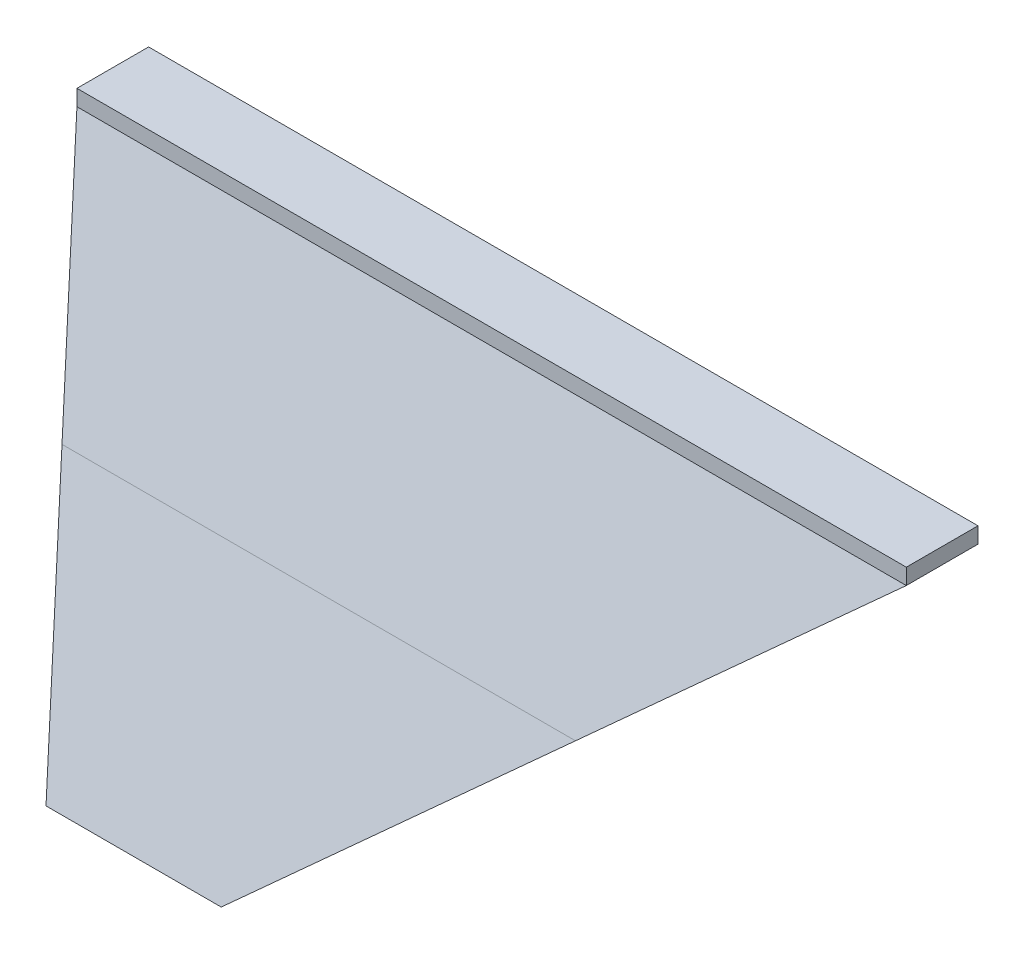
ISO-10303-21;
HEADER;
FILE_DESCRIPTION(('STEP AP214'),'2;1');
FILE_NAME('part.step','',(''),(''),'','','');
FILE_SCHEMA(('AUTOMOTIVE_DESIGN { 1 0 10303 214 1 1 1 1 }'));
ENDSEC;
DATA;
#1=APPLICATION_CONTEXT('core data for automotive mechanical design processes');
#2=APPLICATION_PROTOCOL_DEFINITION('international standard','automotive_design',2000,#1);
#3=PRODUCT_CONTEXT('',#1,'mechanical');
#4=PRODUCT('Part','Part','',(#3));
#5=PRODUCT_RELATED_PRODUCT_CATEGORY('part','',(#4));
#6=PRODUCT_DEFINITION_FORMATION('','',#4);
#7=PRODUCT_DEFINITION_CONTEXT('part definition',#1,'design');
#8=PRODUCT_DEFINITION('design','',#6,#7);
#9=PRODUCT_DEFINITION_SHAPE('','',#8);
#10=(LENGTH_UNIT() NAMED_UNIT(*) SI_UNIT(.MILLI.,.METRE.));
#11=(NAMED_UNIT(*) PLANE_ANGLE_UNIT() SI_UNIT($,.RADIAN.));
#12=(NAMED_UNIT(*) SI_UNIT($,.STERADIAN.) SOLID_ANGLE_UNIT());
#13=UNCERTAINTY_MEASURE_WITH_UNIT(LENGTH_MEASURE(1.E-05),#10,'distance_accuracy_value','');
#14=(GEOMETRIC_REPRESENTATION_CONTEXT(3) GLOBAL_UNCERTAINTY_ASSIGNED_CONTEXT((#13)) GLOBAL_UNIT_ASSIGNED_CONTEXT((#10,
#11,#12)) REPRESENTATION_CONTEXT('',''));
#15=CARTESIAN_POINT('',(0.,0.,0.));
#16=DIRECTION('',(0.,0.,1.));
#17=DIRECTION('',(1.,0.,0.));
#18=AXIS2_PLACEMENT_3D('',#15,#16,#17);
#19=CARTESIAN_POINT('',(0.,-70.5249999999999,0.));
#20=DIRECTION('',(0.,1.,0.));
#21=DIRECTION('',(0.,0.,1.));
#22=AXIS2_PLACEMENT_3D('',#19,#20,#21);
#23=PLANE('',#22);
#24=DIRECTION('',(0.,0.,-1.));
#25=VECTOR('',#24,1.);
#26=CARTESIAN_POINT('',(-44.5830751454981,-70.5249999999999,0.));
#27=LINE('',#26,#25);
#28=CARTESIAN_POINT('',(-44.5830751454981,-70.5249999999999,-44.1671716535433));
#29=VERTEX_POINT('',#28);
#30=CARTESIAN_POINT('',(-44.5830751454981,-70.5249999999999,-46.6671716535434));
#31=VERTEX_POINT('',#30);
#32=EDGE_CURVE('E165',#29,#31,#27,.T.);
#33=ORIENTED_EDGE('',*,*,#32,.F.);
#34=DIRECTION('',(1.,0.,0.));
#35=VECTOR('',#34,1.);
#36=CARTESIAN_POINT('',(111.2625,-70.5249999999999,-44.1671716535434));
#37=LINE('',#36,#35);
#38=CARTESIAN_POINT('',(116.606988188976,-70.5249999999999,-44.1671716535433));
#39=VERTEX_POINT('',#38);
#40=EDGE_CURVE('E173',#29,#39,#37,.T.);
#41=ORIENTED_EDGE('',*,*,#40,.T.);
#42=DIRECTION('',(0.,0.,-1.));
#43=VECTOR('',#42,1.);
#44=CARTESIAN_POINT('',(116.606988188976,-70.5249999999999,0.));
#45=LINE('',#44,#43);
#46=CARTESIAN_POINT('',(116.606988188976,-70.5249999999999,-46.6671716535433));
#47=VERTEX_POINT('',#46);
#48=EDGE_CURVE('E171',#39,#47,#45,.T.);
#49=ORIENTED_EDGE('',*,*,#48,.T.);
#50=DIRECTION('',(-1.,0.,0.));
#51=VECTOR('',#50,1.);
#52=CARTESIAN_POINT('',(0.,-70.5249999999999,-46.6671716535434));
#53=LINE('',#52,#51);
#54=EDGE_CURVE('E168',#47,#31,#53,.T.);
#55=ORIENTED_EDGE('',*,*,#54,.T.);
#56=EDGE_LOOP('',(#33,#41,#49,#55));
#57=FACE_BOUND('',#56,.T.);
#58=ADVANCED_FACE('F77',(#57),#23,.T.);
#59=CARTESIAN_POINT('',(0.,-141.05,0.));
#60=DIRECTION('',(0.,1.,0.));
#61=DIRECTION('',(0.,0.,1.));
#62=AXIS2_PLACEMENT_3D('',#59,#60,#61);
#63=PLANE('',#62);
#64=DIRECTION('',(0.,0.,1.));
#65=VECTOR('',#64,1.);
#66=CARTESIAN_POINT('',(36.3639763779528,-141.05,0.));
#67=LINE('',#66,#65);
#68=CARTESIAN_POINT('',(36.3639763779528,-141.05,-42.1725000000001));
#69=VERTEX_POINT('',#68);
#70=CARTESIAN_POINT('',(36.3639763779528,-141.05,-36.9542126961682));
#71=VERTEX_POINT('',#70);
#72=EDGE_CURVE('E192',#69,#71,#67,.T.);
#73=ORIENTED_EDGE('',*,*,#72,.F.);
#74=DIRECTION('',(-1.,0.,0.));
#75=VECTOR('',#74,1.);
#76=CARTESIAN_POINT('',(0.,-141.05,-42.1725000000001));
#77=LINE('',#76,#75);
#78=CARTESIAN_POINT('',(-25.6661502909962,-141.05,-42.1725000000001));
#79=VERTEX_POINT('',#78);
#80=EDGE_CURVE('E158',#69,#79,#77,.T.);
#81=ORIENTED_EDGE('',*,*,#80,.T.);
#82=DIRECTION('',(0.,0.,-1.));
#83=VECTOR('',#82,1.);
#84=CARTESIAN_POINT('',(-25.6661502909962,-141.05,0.));
#85=LINE('',#84,#83);
#86=CARTESIAN_POINT('',(-25.6661502909962,-141.05,-36.9542126961682));
#87=VERTEX_POINT('',#86);
#88=EDGE_CURVE('E143',#87,#79,#85,.T.);
#89=ORIENTED_EDGE('',*,*,#88,.F.);
#90=DIRECTION('',(-1.,0.,0.));
#91=VECTOR('',#90,1.);
#92=CARTESIAN_POINT('',(0.,-141.05,-36.9542126961682));
#93=LINE('',#92,#91);
#94=EDGE_CURVE('E186',#87,#71,#93,.F.);
#95=ORIENTED_EDGE('',*,*,#94,.T.);
#96=EDGE_LOOP('',(#73,#81,#89,#95));
#97=FACE_BOUND('',#96,.T.);
#98=ADVANCED_FACE('F191',(#97),#63,.T.);
#99=CARTESIAN_POINT('',(-59.2379832493327,-15.8894076945745,0.));
#100=DIRECTION('',(-0.965857974017787,-0.259072140582998,0.));
#101=DIRECTION('',(0.259072140582998,-0.965857974017787,0.));
#102=AXIS2_PLACEMENT_3D('',#99,#100,#101);
#103=PLANE('',#102);
#104=CARTESIAN_POINT('',(-28.3484508729887,-131.05,-36.9542126961682));
#105=DIRECTION('',(-0.965857974017787,-0.259072140582998,0.));
#106=DIRECTION('',(-0.259072140582998,0.965857974017787,0.));
#107=AXIS2_PLACEMENT_3D('',#104,#105,#106);
#108=ELLIPSE('',#107,10.3534890936417,10.);
#109=CARTESIAN_POINT('',(-29.1998166035065,-127.875986855338,-27.4712996122306));
#110=VERTEX_POINT('',#109);
#111=EDGE_CURVE('E167',#110,#87,#108,.F.);
#112=ORIENTED_EDGE('',*,*,#111,.T.);
#113=ORIENTED_EDGE('',*,*,#88,.T.);
#114=DIRECTION('',(-0.259072140582998,0.965857974017787,0.));
#115=VECTOR('',#114,1.);
#116=CARTESIAN_POINT('',(-23.943480015951,-147.472361038171,-42.1725000000001));
#117=LINE('',#116,#115);
#118=CARTESIAN_POINT('',(-24.325,-146.05,-42.1725000000001));
#119=VERTEX_POINT('',#118);
#120=EDGE_CURVE('E137',#119,#79,#117,.T.);
#121=ORIENTED_EDGE('',*,*,#120,.F.);
#122=DIRECTION('',(0.,0.,1.));
#123=VECTOR('',#122,1.);
#124=CARTESIAN_POINT('',(-24.325,-146.05,-90.2725250000001));
#125=LINE('',#124,#123);
#126=CARTESIAN_POINT('',(-24.325,-146.05,-18.8883000000001));
#127=VERTEX_POINT('',#126);
#128=EDGE_CURVE('E140',#119,#127,#125,.T.);
#129=ORIENTED_EDGE('',*,*,#128,.T.);
#130=DIRECTION('',(-0.246510694172273,0.919027106161082,-0.307606332509412));
#131=VECTOR('',#130,1.);
#132=CARTESIAN_POINT('',(-54.5021922203394,-33.5451136239802,-56.5446599218256));
#133=LINE('',#132,#131);
#134=EDGE_CURVE('E92',#127,#29,#133,.T.);
#135=ORIENTED_EDGE('',*,*,#134,.T.);
#136=ORIENTED_EDGE('',*,*,#32,.T.);
#137=DIRECTION('',(0.246510694172273,-0.919027106161082,0.307606332509412));
#138=VECTOR('',#137,1.);
#139=CARTESIAN_POINT('',(-63.5,0.,-70.2725000000001));
#140=LINE('',#139,#138);
#141=EDGE_CURVE('E181',#31,#110,#140,.T.);
#142=ORIENTED_EDGE('',*,*,#141,.T.);
#143=EDGE_LOOP('',(#112,#113,#121,#129,#135,#136,#142));
#144=FACE_BOUND('',#143,.T.);
#145=ADVANCED_FACE('F139',(#144),#103,.T.);
#146=CARTESIAN_POINT('',(85.7891918912163,-97.6105372305572,0.));
#147=DIRECTION('',(-0.660159046311805,0.751125844031936,0.));
#148=DIRECTION('',(-0.751125844031936,-0.660159046311805,0.));
#149=AXIS2_PLACEMENT_3D('',#146,#147,#148);
#150=PLANE('',#149);
#151=DIRECTION('',(0.733434694729322,0.644610423741342,-0.215756692066118));
#152=VECTOR('',#151,1.);
#153=CARTESIAN_POINT('',(80.234624255359,-102.492406363802,-33.4674038605315));
#154=LINE('',#153,#152);
#155=CARTESIAN_POINT('',(30.675,-146.05,-18.8883000000001));
#156=VERTEX_POINT('',#155);
#157=EDGE_CURVE('E201',#156,#39,#154,.T.);
#158=ORIENTED_EDGE('',*,*,#157,.F.);
#159=DIRECTION('',(0.,0.,1.));
#160=VECTOR('',#159,1.);
#161=CARTESIAN_POINT('',(30.675,-146.05,-90.2725250000001));
#162=LINE('',#161,#160);
#163=CARTESIAN_POINT('',(30.675,-146.05,-42.1725000000001));
#164=VERTEX_POINT('',#163);
#165=EDGE_CURVE('E148',#164,#156,#162,.T.);
#166=ORIENTED_EDGE('',*,*,#165,.F.);
#167=DIRECTION('',(-0.751125844031936,-0.660159046311805,0.));
#168=VECTOR('',#167,1.);
#169=CARTESIAN_POINT('',(15.8477833244391,-159.081532995129,-42.1725000000001));
#170=LINE('',#169,#168);
#171=EDGE_CURVE('E157',#69,#164,#170,.T.);
#172=ORIENTED_EDGE('',*,*,#171,.F.);
#173=ORIENTED_EDGE('',*,*,#72,.T.);
#174=CARTESIAN_POINT('',(47.7419291338583,-131.05,-36.9542126961682));
#175=DIRECTION('',(-0.660159046311805,0.751125844031936,0.));
#176=DIRECTION('',(-0.751125844031936,-0.660159046311805,0.));
#177=AXIS2_PLACEMENT_3D('',#174,#175,#176);
#178=ELLIPSE('',#177,15.1478648302531,10.);
#179=CARTESIAN_POINT('',(51.3533062945165,-127.875986855338,-27.4712996122306));
#180=VERTEX_POINT('',#179);
#181=EDGE_CURVE('E198',#180,#71,#178,.F.);
#182=ORIENTED_EDGE('',*,*,#181,.F.);
#183=DIRECTION('',(-0.733434694729322,-0.644610423741342,0.215756692066118));
#184=VECTOR('',#183,1.);
#185=CARTESIAN_POINT('',(196.85,0.,-70.2725));
#186=LINE('',#185,#184);
#187=EDGE_CURVE('E160',#47,#180,#186,.T.);
#188=ORIENTED_EDGE('',*,*,#187,.F.);
#189=ORIENTED_EDGE('',*,*,#48,.F.);
#190=EDGE_LOOP('',(#158,#166,#172,#173,#182,#188,#189));
#191=FACE_BOUND('',#190,.T.);
#192=ADVANCED_FACE('F209',(#191),#150,.F.);
#193=CARTESIAN_POINT('',(0.,-146.05,0.));
#194=DIRECTION('',(0.,-1.,0.));
#195=DIRECTION('',(0.,0.,-1.));
#196=AXIS2_PLACEMENT_3D('',#193,#194,#195);
#197=PLANE('',#196);
#198=ORIENTED_EDGE('',*,*,#165,.T.);
#199=DIRECTION('',(1.,0.,0.));
#200=VECTOR('',#199,1.);
#201=CARTESIAN_POINT('',(-21.825,-146.05,-18.8883000000001));
#202=LINE('',#201,#200);
#203=EDGE_CURVE('E14',#127,#156,#202,.T.);
#204=ORIENTED_EDGE('',*,*,#203,.F.);
#205=ORIENTED_EDGE('',*,*,#128,.F.);
#206=DIRECTION('',(-1.,0.,0.));
#207=VECTOR('',#206,1.);
#208=CARTESIAN_POINT('',(0.,-146.05,-42.1725000000001));
#209=LINE('',#208,#207);
#210=EDGE_CURVE('E86',#164,#119,#209,.T.);
#211=ORIENTED_EDGE('',*,*,#210,.F.);
#212=EDGE_LOOP('',(#198,#204,#205,#211));
#213=FACE_BOUND('',#212,.T.);
#214=ADVANCED_FACE('F153',(#213),#197,.T.);
#215=CARTESIAN_POINT('',(0.,-131.05,-36.9542126961682));
#216=DIRECTION('',(-1.,0.,0.));
#217=DIRECTION('',(0.,0.,1.));
#218=AXIS2_PLACEMENT_3D('',#215,#216,#217);
#219=CYLINDRICAL_SURFACE('',#218,10.);
#220=DIRECTION('',(-1.,0.,0.));
#221=VECTOR('',#220,1.);
#222=CARTESIAN_POINT('',(0.,-127.875986855338,-27.4712996122306));
#223=LINE('',#222,#221);
#224=EDGE_CURVE('E100',#180,#110,#223,.T.);
#225=ORIENTED_EDGE('',*,*,#224,.F.);
#226=ORIENTED_EDGE('',*,*,#181,.T.);
#227=ORIENTED_EDGE('',*,*,#94,.F.);
#228=ORIENTED_EDGE('',*,*,#111,.F.);
#229=EDGE_LOOP('',(#225,#226,#227,#228));
#230=FACE_BOUND('',#229,.T.);
#231=ADVANCED_FACE('F196',(#230),#219,.F.);
#232=CARTESIAN_POINT('',(0.,-21.1512430220413,-63.1929957607801));
#233=DIRECTION('',(0.,0.317401314466158,0.948291308393763));
#234=DIRECTION('',(0.,-0.948291308393763,0.317401314466158));
#235=AXIS2_PLACEMENT_3D('',#232,#233,#234);
#236=PLANE('',#235);
#237=ORIENTED_EDGE('',*,*,#187,.T.);
#238=ORIENTED_EDGE('',*,*,#224,.T.);
#239=ORIENTED_EDGE('',*,*,#141,.F.);
#240=ORIENTED_EDGE('',*,*,#54,.F.);
#241=EDGE_LOOP('',(#237,#238,#239,#240));
#242=FACE_BOUND('',#241,.T.);
#243=ADVANCED_FACE('F213',(#242),#236,.F.);
#244=CARTESIAN_POINT('',(0.,-141.05,-42.1725000000001));
#245=DIRECTION('',(0.,0.,1.));
#246=DIRECTION('',(1.,0.,0.));
#247=AXIS2_PLACEMENT_3D('',#244,#245,#246);
#248=PLANE('',#247);
#249=ORIENTED_EDGE('',*,*,#80,.F.);
#250=ORIENTED_EDGE('',*,*,#171,.T.);
#251=ORIENTED_EDGE('',*,*,#210,.T.);
#252=ORIENTED_EDGE('',*,*,#120,.T.);
#253=EDGE_LOOP('',(#249,#250,#251,#252));
#254=FACE_BOUND('',#253,.T.);
#255=ADVANCED_FACE('F156',(#254),#248,.F.);
#256=CARTESIAN_POINT('',(111.2625,-73.0249999999999,-43.3304));
#257=DIRECTION('',(0.,-0.317401314466158,-0.948291308393763));
#258=DIRECTION('',(0.,0.948291308393763,-0.317401314466158));
#259=AXIS2_PLACEMENT_3D('',#256,#257,#258);
#260=PLANE('',#259);
#261=ORIENTED_EDGE('',*,*,#203,.T.);
#262=ORIENTED_EDGE('',*,*,#157,.T.);
#263=ORIENTED_EDGE('',*,*,#40,.F.);
#264=ORIENTED_EDGE('',*,*,#134,.F.);
#265=EDGE_LOOP('',(#261,#262,#263,#264));
#266=FACE_BOUND('',#265,.T.);
#267=ADVANCED_FACE('F79',(#266),#260,.F.);
#268=CLOSED_SHELL('',(#58,#98,#145,#192,#214,#231,#243,#255,#267));
#269=MANIFOLD_SOLID_BREP('B2',#268);
#270=CARTESIAN_POINT('',(0.,-70.5249999999999,0.));
#271=DIRECTION('',(0.,1.,0.));
#272=DIRECTION('',(0.,0.,1.));
#273=AXIS2_PLACEMENT_3D('',#270,#271,#272);
#274=PLANE('',#273);
#275=DIRECTION('',(1.,0.,0.));
#276=VECTOR('',#275,1.);
#277=CARTESIAN_POINT('',(111.2625,-70.5249999999999,-44.1671716535434));
#278=LINE('',#277,#276);
#279=CARTESIAN_POINT('',(-44.5830751454981,-70.5249999999999,-44.1671716535433));
#280=VERTEX_POINT('',#279);
#281=CARTESIAN_POINT('',(116.606988188976,-70.5249999999999,-44.1671716535433));
#282=VERTEX_POINT('',#281);
#283=EDGE_CURVE('E406',#280,#282,#278,.T.);
#284=ORIENTED_EDGE('',*,*,#283,.F.);
#285=DIRECTION('',(0.,0.,-1.));
#286=VECTOR('',#285,1.);
#287=CARTESIAN_POINT('',(-44.5830751454981,-70.5249999999999,0.));
#288=LINE('',#287,#286);
#289=CARTESIAN_POINT('',(-44.5830751454981,-70.5249999999999,-46.6671716535434));
#290=VERTEX_POINT('',#289);
#291=EDGE_CURVE('E75',#280,#290,#288,.T.);
#292=ORIENTED_EDGE('',*,*,#291,.T.);
#293=DIRECTION('',(-1.,0.,0.));
#294=VECTOR('',#293,1.);
#295=CARTESIAN_POINT('',(0.,-70.5249999999999,-46.6671716535434));
#296=LINE('',#295,#294);
#297=CARTESIAN_POINT('',(116.606988188976,-70.5249999999999,-46.6671716535433));
#298=VERTEX_POINT('',#297);
#299=EDGE_CURVE('E310',#298,#290,#296,.T.);
#300=ORIENTED_EDGE('',*,*,#299,.F.);
#301=DIRECTION('',(0.,0.,-1.));
#302=VECTOR('',#301,1.);
#303=CARTESIAN_POINT('',(116.606988188976,-70.5249999999999,0.));
#304=LINE('',#303,#302);
#305=EDGE_CURVE('E471',#282,#298,#304,.T.);
#306=ORIENTED_EDGE('',*,*,#305,.F.);
#307=EDGE_LOOP('',(#284,#292,#300,#306));
#308=FACE_BOUND('',#307,.T.);
#309=ADVANCED_FACE('F300',(#308),#274,.F.);
#310=CARTESIAN_POINT('',(-59.2379832493327,-15.8894076945745,0.));
#311=DIRECTION('',(-0.965857974017787,-0.259072140582998,0.));
#312=DIRECTION('',(0.259072140582998,-0.965857974017787,0.));
#313=AXIS2_PLACEMENT_3D('',#310,#311,#312);
#314=PLANE('',#313);
#315=ORIENTED_EDGE('',*,*,#291,.F.);
#316=DIRECTION('',(-0.246510694172273,0.919027106161082,-0.307606332509412));
#317=VECTOR('',#316,1.);
#318=CARTESIAN_POINT('',(-54.5021922203394,-33.5451136239802,-56.5446599218256));
#319=LINE('',#318,#317);
#320=CARTESIAN_POINT('',(-63.5,0.,-67.7725000000001));
#321=VERTEX_POINT('',#320);
#322=EDGE_CURVE('E382',#280,#321,#319,.T.);
#323=ORIENTED_EDGE('',*,*,#322,.T.);
#324=DIRECTION('',(0.,0.,1.));
#325=VECTOR('',#324,1.);
#326=CARTESIAN_POINT('',(-63.5,0.,-70.2725000000001));
#327=LINE('',#326,#325);
#328=CARTESIAN_POINT('',(-63.5,0.,-70.2725000000001));
#329=VERTEX_POINT('',#328);
#330=EDGE_CURVE('E481',#329,#321,#327,.T.);
#331=ORIENTED_EDGE('',*,*,#330,.F.);
#332=DIRECTION('',(0.246510694172273,-0.919027106161082,0.307606332509412));
#333=VECTOR('',#332,1.);
#334=CARTESIAN_POINT('',(-63.5,0.,-70.2725000000001));
#335=LINE('',#334,#333);
#336=EDGE_CURVE('E400',#329,#290,#335,.T.);
#337=ORIENTED_EDGE('',*,*,#336,.T.);
#338=EDGE_LOOP('',(#315,#323,#331,#337));
#339=FACE_BOUND('',#338,.T.);
#340=ADVANCED_FACE('F422',(#339),#314,.T.);
#341=CARTESIAN_POINT('',(85.7891918912163,-97.6105372305572,0.));
#342=DIRECTION('',(-0.660159046311805,0.751125844031936,0.));
#343=DIRECTION('',(-0.751125844031936,-0.660159046311805,0.));
#344=AXIS2_PLACEMENT_3D('',#341,#342,#343);
#345=PLANE('',#344);
#346=DIRECTION('',(0.733434694729322,0.644610423741342,-0.215756692066118));
#347=VECTOR('',#346,1.);
#348=CARTESIAN_POINT('',(80.234624255359,-102.492406363802,-33.4674038605315));
#349=LINE('',#348,#347);
#350=CARTESIAN_POINT('',(196.85,0.,-67.7725000000001));
#351=VERTEX_POINT('',#350);
#352=EDGE_CURVE('E390',#282,#351,#349,.T.);
#353=ORIENTED_EDGE('',*,*,#352,.F.);
#354=ORIENTED_EDGE('',*,*,#305,.T.);
#355=DIRECTION('',(-0.733434694729322,-0.644610423741342,0.215756692066118));
#356=VECTOR('',#355,1.);
#357=CARTESIAN_POINT('',(196.85,0.,-70.2725));
#358=LINE('',#357,#356);
#359=CARTESIAN_POINT('',(196.85,0.,-70.2725));
#360=VERTEX_POINT('',#359);
#361=EDGE_CURVE('E396',#360,#298,#358,.T.);
#362=ORIENTED_EDGE('',*,*,#361,.F.);
#363=DIRECTION('',(0.,0.,-1.));
#364=VECTOR('',#363,1.);
#365=CARTESIAN_POINT('',(196.85,0.,-70.2725));
#366=LINE('',#365,#364);
#367=EDGE_CURVE('E303',#351,#360,#366,.T.);
#368=ORIENTED_EDGE('',*,*,#367,.F.);
#369=EDGE_LOOP('',(#353,#354,#362,#368));
#370=FACE_BOUND('',#369,.T.);
#371=ADVANCED_FACE('F413',(#370),#345,.F.);
#372=CARTESIAN_POINT('',(0.,0.,0.));
#373=DIRECTION('',(0.,1.,0.));
#374=DIRECTION('',(0.,0.,1.));
#375=AXIS2_PLACEMENT_3D('',#372,#373,#374);
#376=PLANE('',#375);
#377=DIRECTION('',(-1.,0.,0.));
#378=VECTOR('',#377,1.);
#379=CARTESIAN_POINT('',(-63.5,0.,-70.2725000000001));
#380=LINE('',#379,#378);
#381=EDGE_CURVE('E375',#360,#329,#380,.T.);
#382=ORIENTED_EDGE('',*,*,#381,.T.);
#383=DIRECTION('',(0.,0.,1.));
#384=VECTOR('',#383,1.);
#385=CARTESIAN_POINT('',(-63.5,0.,-67.7725000000001));
#386=LINE('',#385,#384);
#387=CARTESIAN_POINT('',(-63.5,0.,-90.2725000000001));
#388=VERTEX_POINT('',#387);
#389=EDGE_CURVE('E361',#388,#329,#386,.T.);
#390=ORIENTED_EDGE('',*,*,#389,.F.);
#391=DIRECTION('',(1.,0.,0.));
#392=VECTOR('',#391,1.);
#393=CARTESIAN_POINT('',(0.,0.,-90.2725000000001));
#394=LINE('',#393,#392);
#395=CARTESIAN_POINT('',(196.85,0.,-90.2725));
#396=VERTEX_POINT('',#395);
#397=EDGE_CURVE('E373',#388,#396,#394,.T.);
#398=ORIENTED_EDGE('',*,*,#397,.T.);
#399=DIRECTION('',(0.,0.,-1.));
#400=VECTOR('',#399,1.);
#401=CARTESIAN_POINT('',(196.85,0.,-67.7725000000001));
#402=LINE('',#401,#400);
#403=EDGE_CURVE('E326',#360,#396,#402,.T.);
#404=ORIENTED_EDGE('',*,*,#403,.F.);
#405=EDGE_LOOP('',(#382,#390,#398,#404));
#406=FACE_BOUND('',#405,.T.);
#407=ADVANCED_FACE('F372',(#406),#376,.F.);
#408=CARTESIAN_POINT('',(0.,5.,0.));
#409=DIRECTION('',(0.,1.,0.));
#410=DIRECTION('',(0.,0.,1.));
#411=AXIS2_PLACEMENT_3D('',#408,#409,#410);
#412=PLANE('',#411);
#413=DIRECTION('',(0.,0.,1.));
#414=VECTOR('',#413,1.);
#415=CARTESIAN_POINT('',(-63.5,5.,-67.7725000000001));
#416=LINE('',#415,#414);
#417=CARTESIAN_POINT('',(-63.5,5.,-90.2725000000001));
#418=VERTEX_POINT('',#417);
#419=CARTESIAN_POINT('',(-63.5,5.,-67.7725000000001));
#420=VERTEX_POINT('',#419);
#421=EDGE_CURVE('E318',#418,#420,#416,.T.);
#422=ORIENTED_EDGE('',*,*,#421,.T.);
#423=DIRECTION('',(1.,0.,0.));
#424=VECTOR('',#423,1.);
#425=CARTESIAN_POINT('',(0.,5.,-67.7725000000001));
#426=LINE('',#425,#424);
#427=CARTESIAN_POINT('',(196.85,5.,-67.7725000000001));
#428=VERTEX_POINT('',#427);
#429=EDGE_CURVE('E394',#420,#428,#426,.T.);
#430=ORIENTED_EDGE('',*,*,#429,.T.);
#431=DIRECTION('',(0.,0.,-1.));
#432=VECTOR('',#431,1.);
#433=CARTESIAN_POINT('',(196.85,5.,-67.7725000000001));
#434=LINE('',#433,#432);
#435=CARTESIAN_POINT('',(196.85,5.,-90.2725));
#436=VERTEX_POINT('',#435);
#437=EDGE_CURVE('E465',#428,#436,#434,.T.);
#438=ORIENTED_EDGE('',*,*,#437,.T.);
#439=DIRECTION('',(1.,0.,0.));
#440=VECTOR('',#439,1.);
#441=CARTESIAN_POINT('',(0.,5.,-90.2725000000001));
#442=LINE('',#441,#440);
#443=EDGE_CURVE('E387',#418,#436,#442,.T.);
#444=ORIENTED_EDGE('',*,*,#443,.F.);
#445=EDGE_LOOP('',(#422,#430,#438,#444));
#446=FACE_BOUND('',#445,.T.);
#447=ADVANCED_FACE('F431',(#446),#412,.T.);
#448=CARTESIAN_POINT('',(0.,-21.1512430220413,-63.1929957607801));
#449=DIRECTION('',(0.,0.317401314466158,0.948291308393763));
#450=DIRECTION('',(0.,-0.948291308393763,0.317401314466158));
#451=AXIS2_PLACEMENT_3D('',#448,#449,#450);
#452=PLANE('',#451);
#453=ORIENTED_EDGE('',*,*,#361,.T.);
#454=ORIENTED_EDGE('',*,*,#299,.T.);
#455=ORIENTED_EDGE('',*,*,#336,.F.);
#456=ORIENTED_EDGE('',*,*,#381,.F.);
#457=EDGE_LOOP('',(#453,#454,#455,#456));
#458=FACE_BOUND('',#457,.T.);
#459=ADVANCED_FACE('F427',(#458),#452,.F.);
#460=CARTESIAN_POINT('',(111.2625,-73.0249999999999,-43.3304));
#461=DIRECTION('',(0.,-0.317401314466158,-0.948291308393763));
#462=DIRECTION('',(0.,0.948291308393763,-0.317401314466158));
#463=AXIS2_PLACEMENT_3D('',#460,#461,#462);
#464=PLANE('',#463);
#465=DIRECTION('',(1.,0.,0.));
#466=VECTOR('',#465,1.);
#467=CARTESIAN_POINT('',(0.,0.,-67.7725000000001));
#468=LINE('',#467,#466);
#469=EDGE_CURVE('E381',#321,#351,#468,.T.);
#470=ORIENTED_EDGE('',*,*,#469,.F.);
#471=ORIENTED_EDGE('',*,*,#322,.F.);
#472=ORIENTED_EDGE('',*,*,#283,.T.);
#473=ORIENTED_EDGE('',*,*,#352,.T.);
#474=EDGE_LOOP('',(#470,#471,#472,#473));
#475=FACE_BOUND('',#474,.T.);
#476=ADVANCED_FACE('F430',(#475),#464,.F.);
#477=CARTESIAN_POINT('',(0.,5.,-67.7725000000001));
#478=DIRECTION('',(0.,0.,-1.));
#479=DIRECTION('',(-1.,0.,0.));
#480=AXIS2_PLACEMENT_3D('',#477,#478,#479);
#481=PLANE('',#480);
#482=ORIENTED_EDGE('',*,*,#429,.F.);
#483=DIRECTION('',(0.,-1.,0.));
#484=VECTOR('',#483,1.);
#485=CARTESIAN_POINT('',(-63.5,35.1039864469807,-67.7725000000001));
#486=LINE('',#485,#484);
#487=EDGE_CURVE('E498',#420,#321,#486,.T.);
#488=ORIENTED_EDGE('',*,*,#487,.T.);
#489=ORIENTED_EDGE('',*,*,#469,.T.);
#490=DIRECTION('',(0.,-1.,0.));
#491=VECTOR('',#490,1.);
#492=CARTESIAN_POINT('',(196.85,35.1039864469807,-67.7725000000001));
#493=LINE('',#492,#491);
#494=EDGE_CURVE('E463',#428,#351,#493,.T.);
#495=ORIENTED_EDGE('',*,*,#494,.F.);
#496=EDGE_LOOP('',(#482,#488,#489,#495));
#497=FACE_BOUND('',#496,.T.);
#498=ADVANCED_FACE('F436',(#497),#481,.F.);
#499=CARTESIAN_POINT('',(0.,5.,-90.2725000000001));
#500=DIRECTION('',(0.,0.,-1.));
#501=DIRECTION('',(-1.,0.,0.));
#502=AXIS2_PLACEMENT_3D('',#499,#500,#501);
#503=PLANE('',#502);
#504=DIRECTION('',(0.,-1.,0.));
#505=VECTOR('',#504,1.);
#506=CARTESIAN_POINT('',(-63.5,35.1039864469807,-90.2725000000001));
#507=LINE('',#506,#505);
#508=EDGE_CURVE('E358',#418,#388,#507,.T.);
#509=ORIENTED_EDGE('',*,*,#508,.F.);
#510=ORIENTED_EDGE('',*,*,#443,.T.);
#511=DIRECTION('',(0.,-1.,0.));
#512=VECTOR('',#511,1.);
#513=CARTESIAN_POINT('',(196.85,35.1039864469807,-90.2725));
#514=LINE('',#513,#512);
#515=EDGE_CURVE('E379',#436,#396,#514,.T.);
#516=ORIENTED_EDGE('',*,*,#515,.T.);
#517=ORIENTED_EDGE('',*,*,#397,.F.);
#518=EDGE_LOOP('',(#509,#510,#516,#517));
#519=FACE_BOUND('',#518,.T.);
#520=ADVANCED_FACE('F378',(#519),#503,.T.);
#521=CARTESIAN_POINT('',(196.85,35.1039864469807,-67.7725000000001));
#522=DIRECTION('',(-1.,0.,0.));
#523=DIRECTION('',(0.,0.,1.));
#524=AXIS2_PLACEMENT_3D('',#521,#522,#523);
#525=PLANE('',#524);
#526=ORIENTED_EDGE('',*,*,#494,.T.);
#527=ORIENTED_EDGE('',*,*,#367,.T.);
#528=ORIENTED_EDGE('',*,*,#403,.T.);
#529=ORIENTED_EDGE('',*,*,#515,.F.);
#530=ORIENTED_EDGE('',*,*,#437,.F.);
#531=EDGE_LOOP('',(#526,#527,#528,#529,#530));
#532=FACE_BOUND('',#531,.T.);
#533=ADVANCED_FACE('F433',(#532),#525,.F.);
#534=CARTESIAN_POINT('',(-63.5,35.1039864469807,-67.7725000000001));
#535=DIRECTION('',(1.,0.,0.));
#536=DIRECTION('',(0.,0.,-1.));
#537=AXIS2_PLACEMENT_3D('',#534,#535,#536);
#538=PLANE('',#537);
#539=ORIENTED_EDGE('',*,*,#508,.T.);
#540=ORIENTED_EDGE('',*,*,#389,.T.);
#541=ORIENTED_EDGE('',*,*,#330,.T.);
#542=ORIENTED_EDGE('',*,*,#487,.F.);
#543=ORIENTED_EDGE('',*,*,#421,.F.);
#544=EDGE_LOOP('',(#539,#540,#541,#542,#543));
#545=FACE_BOUND('',#544,.T.);
#546=ADVANCED_FACE('F360',(#545),#538,.F.);
#547=CLOSED_SHELL('',(#309,#340,#371,#407,#447,#459,#476,#498,#520,#533,#546));
#548=MANIFOLD_SOLID_BREP('B8',#547);
#549=ADVANCED_BREP_SHAPE_REPRESENTATION('',(#18,#269,#548),#14);
#550=SHAPE_DEFINITION_REPRESENTATION(#9,#549);
ENDSEC;
END-ISO-10303-21;
